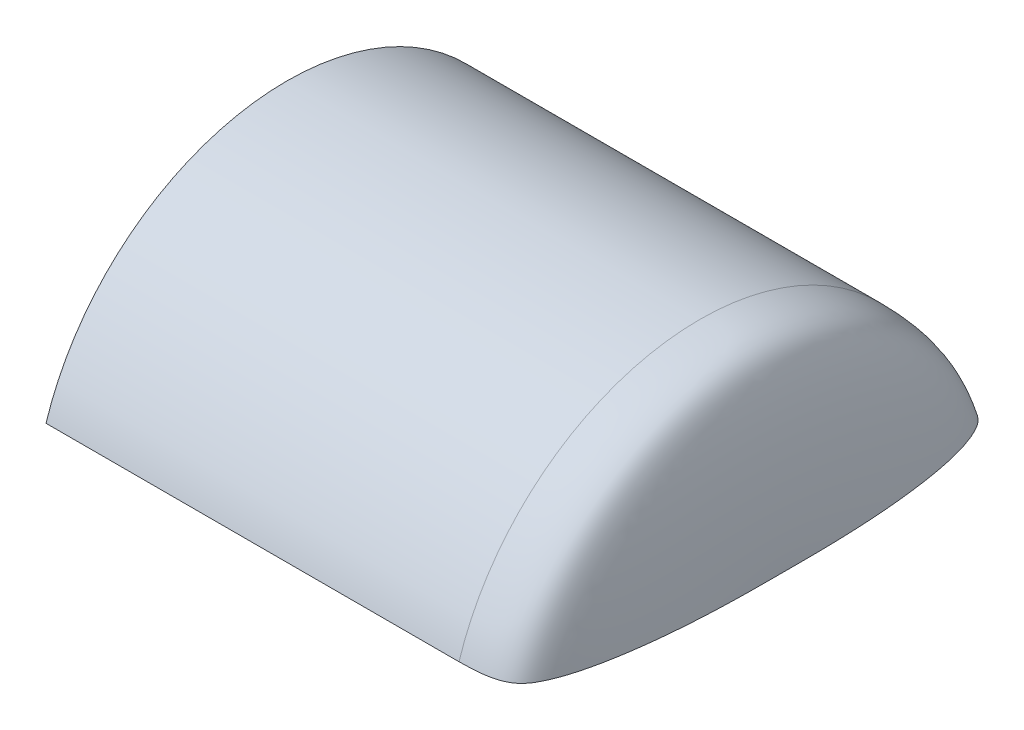
ISO-10303-21;
HEADER;
FILE_DESCRIPTION(('STEP AP214'),'2;1');
FILE_NAME('part.step','',(''),(''),'','','');
FILE_SCHEMA(('AUTOMOTIVE_DESIGN { 1 0 10303 214 1 1 1 1 }'));
ENDSEC;
DATA;
#1=APPLICATION_CONTEXT('core data for automotive mechanical design processes');
#2=APPLICATION_PROTOCOL_DEFINITION('international standard','automotive_design',2000,#1);
#3=PRODUCT_CONTEXT('',#1,'mechanical');
#4=PRODUCT('Part','Part','',(#3));
#5=PRODUCT_RELATED_PRODUCT_CATEGORY('part','',(#4));
#6=PRODUCT_DEFINITION_FORMATION('','',#4);
#7=PRODUCT_DEFINITION_CONTEXT('part definition',#1,'design');
#8=PRODUCT_DEFINITION('design','',#6,#7);
#9=PRODUCT_DEFINITION_SHAPE('','',#8);
#10=(LENGTH_UNIT() NAMED_UNIT(*) SI_UNIT(.MILLI.,.METRE.));
#11=(NAMED_UNIT(*) PLANE_ANGLE_UNIT() SI_UNIT($,.RADIAN.));
#12=(NAMED_UNIT(*) SI_UNIT($,.STERADIAN.) SOLID_ANGLE_UNIT());
#13=UNCERTAINTY_MEASURE_WITH_UNIT(LENGTH_MEASURE(1.E-05),#10,'distance_accuracy_value','');
#14=(GEOMETRIC_REPRESENTATION_CONTEXT(3) GLOBAL_UNCERTAINTY_ASSIGNED_CONTEXT((#13)) GLOBAL_UNIT_ASSIGNED_CONTEXT((#10,
#11,#12)) REPRESENTATION_CONTEXT('',''));
#15=CARTESIAN_POINT('',(0.,0.,0.));
#16=DIRECTION('',(0.,0.,1.));
#17=DIRECTION('',(1.,0.,0.));
#18=AXIS2_PLACEMENT_3D('',#15,#16,#17);
#19=CARTESIAN_POINT('',(38.,-5.00000000000001,0.));
#20=CARTESIAN_POINT('',(38.,-1.99999999999994,0.));
#21=CARTESIAN_POINT('',(37.0755397439433,14.3643578035948,0.));
#22=CARTESIAN_POINT('',(32.098350771493,18.,0.));
#23=CARTESIAN_POINT('',(26.8864656824635,18.,0.));
#24=B_SPLINE_CURVE_WITH_KNOTS('',3,(#19,#20,#21,#22,#23),.UNSPECIFIED.,.F.,.F.,(4,1,4),(0.,
0.72235855820976,1.),.UNSPECIFIED.);
#25=CARTESIAN_POINT('',(-27.,-15.,0.));
#26=DIRECTION('',(-1.,0.,0.));
#27=AXIS1_PLACEMENT('',#25,#26);
#28=SURFACE_OF_REVOLUTION('',#24,#27);
#29=CARTESIAN_POINT('',(26.9525525955181,-15.,0.));
#30=DIRECTION('',(-1.,0.,0.));
#31=DIRECTION('',(0.,0.,1.));
#32=AXIS2_PLACEMENT_3D('',#29,#30,#31);
#33=CIRCLE('',#32,32.9999455653716);
#34=CARTESIAN_POINT('',(26.952552595518,-5.,31.4483132666521));
#35=VERTEX_POINT('',#34);
#36=CARTESIAN_POINT('',(26.9525525955126,-5.,-31.4483132666521));
#37=VERTEX_POINT('',#36);
#38=EDGE_CURVE('E12',#35,#37,#33,.T.);
#39=ORIENTED_EDGE('',*,*,#38,.F.);
#40=CARTESIAN_POINT('',(26.9525525955126,-5.,-31.4483132666521));
#41=CARTESIAN_POINT('',(27.136480431403,-5.,-31.4479734762556));
#42=CARTESIAN_POINT('',(27.3204158722342,-5.,-31.4463297284682));
#43=CARTESIAN_POINT('',(27.6897594486817,-5.,-31.4398508128173));
#44=CARTESIAN_POINT('',(27.8751671076364,-5.,-31.4349892120425));
#45=CARTESIAN_POINT('',(28.2467870626247,-5.,-31.4214437368614));
#46=CARTESIAN_POINT('',(28.4329986892358,-5.,-31.4127406681363));
#47=CARTESIAN_POINT('',(28.8055457382023,-5.,-31.3907104768516));
#48=CARTESIAN_POINT('',(28.9918806031243,-5.,-31.3773737086056));
#49=CARTESIAN_POINT('',(29.3791677863206,-5.,-31.343785343024));
#50=CARTESIAN_POINT('',(29.5800802893616,-5.,-31.3230607548671));
#51=CARTESIAN_POINT('',(29.9805138152054,-5.,-31.2734729281269));
#52=CARTESIAN_POINT('',(30.1800368291149,-5.,-31.2446262158856));
#53=CARTESIAN_POINT('',(30.5768114233629,-5.00000000000001,-31.1767057905779));
#54=CARTESIAN_POINT('',(30.7740677287831,-5.00000000000001,-31.1376603098295));
#55=CARTESIAN_POINT('',(31.1653603021359,-5.,-31.0465396159089));
#56=CARTESIAN_POINT('',(31.3594006626512,-5.,-30.9944825789291));
#57=CARTESIAN_POINT('',(31.6802533801878,-5.,-30.8933442113621));
#58=CARTESIAN_POINT('',(31.8084714969214,-5.,-30.8487669247777));
#59=CARTESIAN_POINT('',(31.9982508629848,-5.00000000000001,-30.7753132407874));
#60=CARTESIAN_POINT('',(32.0610905749903,-5.,-30.7497285822683));
#61=CARTESIAN_POINT('',(32.1857888644922,-5.,-30.6962075532753));
#62=CARTESIAN_POINT('',(32.247647042081,-5.00000000000001,-30.6682702520891));
#63=CARTESIAN_POINT('',(32.4294178562076,-5.,-30.5817025031528));
#64=CARTESIAN_POINT('',(32.5476641940402,-4.99999999999999,-30.5195012683877));
#65=CARTESIAN_POINT('',(32.7780541670037,-5.00000000000002,-30.3847177252778));
#66=CARTESIAN_POINT('',(32.8902007897619,-5.00000000000005,-30.312140563413));
#67=CARTESIAN_POINT('',(33.0718435916206,-5.00000000000003,-30.1816373566058));
#68=CARTESIAN_POINT('',(33.1434022601618,-5.00000000000001,-30.1265654535497));
#69=CARTESIAN_POINT('',(33.282685120537,-5.,-30.0117458000265));
#70=CARTESIAN_POINT('',(33.3504089049991,-5.,-29.9519975544011));
#71=CARTESIAN_POINT('',(33.4817259241335,-5.00000000000001,-29.8281740990899));
#72=CARTESIAN_POINT('',(33.5453205976452,-5.00000000000001,-29.7641004127047));
#73=CARTESIAN_POINT('',(33.6687878629343,-5.,-29.6315620492068));
#74=CARTESIAN_POINT('',(33.7286286465875,-5.,-29.563067813028));
#75=CARTESIAN_POINT('',(33.8441701259658,-5.,-29.422659890067));
#76=CARTESIAN_POINT('',(33.8998699595214,-5.,-29.3507454962708));
#77=CARTESIAN_POINT('',(34.007387269249,-5.,-29.2040645210081));
#78=CARTESIAN_POINT('',(34.0592039218982,-5.,-29.129297339584));
#79=CARTESIAN_POINT('',(34.2006333337967,-5.,-28.9148234750103));
#80=CARTESIAN_POINT('',(34.2861667929666,-5.,-28.7724220061468));
#81=CARTESIAN_POINT('',(34.4078058656052,-5.,-28.5550910381638));
#82=CARTESIAN_POINT('',(34.4472655240618,-5.,-28.4819771643743));
#83=CARTESIAN_POINT('',(34.5243365350378,-5.,-28.3347798790779));
#84=CARTESIAN_POINT('',(34.5619479371321,-5.,-28.2606964936433));
#85=CARTESIAN_POINT('',(34.6724961422698,-5.,-28.0370369435317));
#86=CARTESIAN_POINT('',(34.7430268601424,-5.,-27.8862701709281));
#87=CARTESIAN_POINT('',(34.8785578926473,-5.,-27.5822517900721));
#88=CARTESIAN_POINT('',(34.9435570340662,-5.,-27.4289996628566));
#89=CARTESIAN_POINT('',(35.069285765062,-5.,-27.1192776189783));
#90=CARTESIAN_POINT('',(35.1299754184831,-5.,-26.9627915495483));
#91=CARTESIAN_POINT('',(35.2470125933516,-5.,-26.6484566135313));
#92=CARTESIAN_POINT('',(35.303365994579,-5.,-26.4906099269987));
#93=CARTESIAN_POINT('',(35.4122830334453,-5.,-26.173747843452));
#94=CARTESIAN_POINT('',(35.4648494266071,-5.,-26.014733390898));
#95=CARTESIAN_POINT('',(35.5666274755576,-5.,-25.6956936320282));
#96=CARTESIAN_POINT('',(35.6158401721178,-5.,-25.535668656314));
#97=CARTESIAN_POINT('',(35.7648168595895,-5.,-25.0347205310505));
#98=CARTESIAN_POINT('',(35.8593607855281,-5.,-24.6922394852544));
#99=CARTESIAN_POINT('',(36.0375498478023,-5.,-24.0044346792753));
#100=CARTESIAN_POINT('',(36.1211932193623,-5.,-23.6591104683879));
#101=CARTESIAN_POINT('',(36.2794881704052,-5.,-22.9658024948441));
#102=CARTESIAN_POINT('',(36.3541242900539,-5.,-22.6178152198357));
#103=CARTESIAN_POINT('',(36.4955867434678,-5.,-21.9202546060135));
#104=CARTESIAN_POINT('',(36.562412799773,-5.,-21.5706812113092));
#105=CARTESIAN_POINT('',(36.6893874346584,-5.,-20.8697094168381));
#106=CARTESIAN_POINT('',(36.7495243569623,-5.,-20.5183089146505));
#107=CARTESIAN_POINT('',(36.8637855250613,-5.,-19.8145336405629));
#108=CARTESIAN_POINT('',(36.9179096976133,-5.,-19.4621588568484));
#109=CARTESIAN_POINT('',(37.0722757587965,-5.,-18.4036863356056));
#110=CARTESIAN_POINT('',(37.1644811137576,-5.,-17.6964103695103));
#111=CARTESIAN_POINT('',(37.3309162503096,-5.,-16.2819554548718));
#112=CARTESIAN_POINT('',(37.4051994980892,-5.,-15.5747826689874));
#113=CARTESIAN_POINT('',(37.5384540166116,-5.,-14.1599661555869));
#114=CARTESIAN_POINT('',(37.5974457714543,-5.,-13.4523243445311));
#115=CARTESIAN_POINT('',(37.7018582304228,-5.,-12.0364992983688));
#116=CARTESIAN_POINT('',(37.7472874653447,-5.,-11.3283166856949));
#117=CARTESIAN_POINT('',(37.8257788745401,-5.00000000000001,-9.91129414806904));
#118=CARTESIAN_POINT('',(37.8588414695558,-5.00000000000001,-9.20245424630231));
#119=CARTESIAN_POINT('',(37.9044025330919,-5.00000000000001,-8.02179969819269));
#120=CARTESIAN_POINT('',(37.9200797145402,-5.,-7.55010408379088));
#121=CARTESIAN_POINT('',(37.9467153301325,-5.,-6.60647891340279));
#122=CARTESIAN_POINT('',(37.9576727569366,-5.,-6.13454932897664));
#123=CARTESIAN_POINT('',(37.9753134996958,-5.,-5.19058884678525));
#124=CARTESIAN_POINT('',(37.9819966034266,-5.,-4.71855794515333));
#125=CARTESIAN_POINT('',(37.9917938037771,-5.,-3.77467803439158));
#126=CARTESIAN_POINT('',(37.9949095370877,-5.,-3.30282904121573));
#127=CARTESIAN_POINT('',(37.9987452176436,-5.,-2.35914940507137));
#128=CARTESIAN_POINT('',(37.9994652952668,-5.00000000000001,-1.88731876250176));
#129=CARTESIAN_POINT('',(37.9999181030361,-5.,-1.17957358898001));
#130=CARTESIAN_POINT('',(37.9999644877564,-5.,-0.943658875944369));
#131=CARTESIAN_POINT('',(38.00000499613,-5.00000000000001,-0.471829440144158));
#132=CARTESIAN_POINT('',(37.9999991197921,-5.00000000000001,-0.235914717379595));
#133=CARTESIAN_POINT('',(38.000001087769,-5.00000000000001,0.291545577142286));
#134=CARTESIAN_POINT('',(38.0000124942992,-5.00000000000001,0.583091146060518));
#135=CARTESIAN_POINT('',(37.9999169383666,-5.,1.16618241976754));
#136=CARTESIAN_POINT('',(37.9998099758475,-5.,1.45772812455634));
#137=CARTESIAN_POINT('',(37.999137352639,-5.,2.04081963151991));
#138=CARTESIAN_POINT('',(37.998571691409,-5.,2.3323654336944));
#139=CARTESIAN_POINT('',(37.9966159928841,-5.,2.91545407572311));
#140=CARTESIAN_POINT('',(37.9952259561142,-5.,3.2069969155791));
#141=CARTESIAN_POINT('',(37.9893267593963,-5.,4.08161598706542));
#142=CARTESIAN_POINT('',(37.9830885134119,-5.,4.6646830902612));
#143=CARTESIAN_POINT('',(37.9643230882571,-5.,5.83077460896654));
#144=CARTESIAN_POINT('',(37.9517953229083,-5.,6.41379901543043));
#145=CARTESIAN_POINT('',(37.9195575011111,-5.,7.57965909529887));
#146=CARTESIAN_POINT('',(37.8998473592325,-5.,8.16249476637599));
#147=CARTESIAN_POINT('',(37.8526470128677,-5.,9.3278422349456));
#148=CARTESIAN_POINT('',(37.8251569552231,-5.,9.91035403834302));
#149=CARTESIAN_POINT('',(37.7610228182227,-5.,11.090420424919));
#150=CARTESIAN_POINT('',(37.7241546601702,-5.,11.6879629164199));
#151=CARTESIAN_POINT('',(37.6409862926568,-5.,12.8824118854146));
#152=CARTESIAN_POINT('',(37.5946858196393,-5.,13.4793183446678));
#153=CARTESIAN_POINT('',(37.4917631434494,-5.,14.6723242898484));
#154=CARTESIAN_POINT('',(37.4351396102031,-5.,15.2684236618046));
#155=CARTESIAN_POINT('',(37.3103347430002,-5.,16.4597064174528));
#156=CARTESIAN_POINT('',(37.2421479435001,-5.,17.0548892330542));
#157=CARTESIAN_POINT('',(37.0925544762656,-5.,18.2435449594863));
#158=CARTESIAN_POINT('',(37.0111491424058,-5.,18.8370180367024));
#159=CARTESIAN_POINT('',(36.8327518916468,-5.00000000000001,20.0214945650221));
#160=CARTESIAN_POINT('',(36.7357638308317,-5.00000000000001,20.6124985900876));
#161=CARTESIAN_POINT('',(36.541340828008,-5.00000000000001,21.6879559558543));
#162=CARTESIAN_POINT('',(36.4469551438508,-5.00000000000001,22.1729538514985));
#163=CARTESIAN_POINT('',(36.2934231225142,-5.,22.8980128447925));
#164=CARTESIAN_POINT('',(36.2402417980955,-5.,23.1393404922709));
#165=CARTESIAN_POINT('',(36.129405018738,-5.,23.6209632596299));
#166=CARTESIAN_POINT('',(36.071749702797,-5.,23.8612584113434));
#167=CARTESIAN_POINT('',(35.9514144654106,-5.,24.3404366144067));
#168=CARTESIAN_POINT('',(35.8887376172365,-5.,24.5793204348249));
#169=CARTESIAN_POINT('',(35.7575972540329,-5.,25.0554866842399));
#170=CARTESIAN_POINT('',(35.6891341030541,-5.,25.2927692129707));
#171=CARTESIAN_POINT('',(35.5455299674777,-5.,25.765151330185));
#172=CARTESIAN_POINT('',(35.4703931818482,-5.,26.0002521899214));
#173=CARTESIAN_POINT('',(35.3122144842981,-5.00000000000001,26.4677639208346));
#174=CARTESIAN_POINT('',(35.2291739376099,-5.00000000000001,26.700175248829));
#175=CARTESIAN_POINT('',(35.0971627426632,-5.00000000000001,27.0468941940641));
#176=CARTESIAN_POINT('',(35.0517427522365,-5.,27.162557726892));
#177=CARTESIAN_POINT('',(34.9582200974916,-5.,27.3928123140017));
#178=CARTESIAN_POINT('',(34.9101171699769,-5.,27.5074032617703));
#179=CARTESIAN_POINT('',(34.8109161755962,-5.,27.7353326335093));
#180=CARTESIAN_POINT('',(34.7598170682099,-5.,27.8486706059076));
#181=CARTESIAN_POINT('',(34.6542934254986,-5.,28.0737766939399));
#182=CARTESIAN_POINT('',(34.5998692505117,-5.,28.1855449780726));
#183=CARTESIAN_POINT('',(34.4872641827884,-5.,28.4071573038611));
#184=CARTESIAN_POINT('',(34.4290840625581,-5.00000000000001,28.5170017353354));
#185=CARTESIAN_POINT('',(34.3077650112187,-5.,28.7339032664629));
#186=CARTESIAN_POINT('',(34.2446275221263,-5.,28.8409611646964));
#187=CARTESIAN_POINT('',(34.1107449177515,-5.,29.0534923639459));
#188=CARTESIAN_POINT('',(34.0398650672657,-5.,29.1588816566719));
#189=CARTESIAN_POINT('',(33.8905616599877,-5.00000000000001,29.3641927240216));
#190=CARTESIAN_POINT('',(33.8121396295354,-5.00000000000001,29.4641155985108));
#191=CARTESIAN_POINT('',(33.6474727107738,-5.,29.6564979476019));
#192=CARTESIAN_POINT('',(33.5612677987227,-5.,29.7489914134705));
#193=CARTESIAN_POINT('',(33.3807062594319,-5.00000000000001,29.9256697026315));
#194=CARTESIAN_POINT('',(33.28634983842,-5.00000000000002,30.0098547360063));
#195=CARTESIAN_POINT('',(33.0898108058939,-5.00000000000002,30.1692808399992));
#196=CARTESIAN_POINT('',(32.987601668018,-5.00000000000001,30.2444891885725));
#197=CARTESIAN_POINT('',(32.7768111730877,-5.,30.3853526623773));
#198=CARTESIAN_POINT('',(32.6682290969681,-5.,30.4510067066678));
#199=CARTESIAN_POINT('',(32.4455027275867,-5.00000000000001,30.5734012330753));
#200=CARTESIAN_POINT('',(32.3313341067638,-5.00000000000001,30.6300971413046));
#201=CARTESIAN_POINT('',(32.0991832274175,-5.,30.7349720238978));
#202=CARTESIAN_POINT('',(31.981200781299,-5.,30.7831505785522));
#203=CARTESIAN_POINT('',(31.6831173651786,-4.99999999999999,30.8940471980906));
#204=CARTESIAN_POINT('',(31.5012831933142,-5.,30.9520926899803));
#205=CARTESIAN_POINT('',(31.133662364947,-5.00000000000001,31.0546356419621));
#206=CARTESIAN_POINT('',(30.9478702313674,-5.00000000000001,31.0991128205511));
#207=CARTESIAN_POINT('',(30.5739187600747,-5.,31.1772653935749));
#208=CARTESIAN_POINT('',(30.3857576669704,-5.,31.2109322202736));
#209=CARTESIAN_POINT('',(30.0071667940879,-5.,31.2697848958489));
#210=CARTESIAN_POINT('',(29.816730343539,-5.,31.2949267528316));
#211=CARTESIAN_POINT('',(29.4352701292762,-5.00000000000001,31.3382018578953));
#212=CARTESIAN_POINT('',(29.2442471210194,-5.00000000000001,31.3563419284822));
#213=CARTESIAN_POINT('',(28.8617925837505,-5.,31.3869623558985));
#214=CARTESIAN_POINT('',(28.6703611357319,-4.99999999999999,31.3994437459213));
#215=CARTESIAN_POINT('',(28.39369304536,-5.,31.4141135200853));
#216=CARTESIAN_POINT('',(28.3085493437764,-5.,31.4181677493044));
#217=CARTESIAN_POINT('',(28.1382222899206,-5.00000000000001,31.4254290299801));
#218=CARTESIAN_POINT('',(28.0530389363673,-5.,31.4286360518405));
#219=CARTESIAN_POINT('',(27.8826444993596,-5.,31.434270707577));
#220=CARTESIAN_POINT('',(27.7974334151342,-5.,31.4366983175242));
#221=CARTESIAN_POINT('',(27.4590456499415,-5.00000000000001,31.4449001017862));
#222=CARTESIAN_POINT('',(27.205796582021,-5.00000000000001,31.4478410955669));
#223=CARTESIAN_POINT('',(26.952552595518,-4.99999999999999,31.4483132666521));
#224=B_SPLINE_CURVE_WITH_KNOTS('',3,(#40,#41,#42,#43,#44,#45,#46,#47,#48,#49,#50,#51,#52,#53,
#54,#55,#56,#57,#58,#59,#60,#61,#62,#63,#64,#65,#66,#67,#68,#69,#70,#71,#72,#73,#74,#75,#76,#77,
#78,#79,#80,#81,#82,#83,#84,#85,#86,#87,#88,#89,#90,#91,#92,#93,#94,#95,#96,#97,#98,#99,#100,
#101,#102,#103,#104,#105,#106,#107,#108,#109,#110,#111,#112,#113,#114,#115,#116,#117,#118,#119,
#120,#121,#122,#123,#124,#125,#126,#127,#128,#129,#130,#131,#132,#133,#134,#135,#136,#137,#138,
#139,#140,#141,#142,#143,#144,#145,#146,#147,#148,#149,#150,#151,#152,#153,#154,#155,#156,#157,
#158,#159,#160,#161,#162,#163,#164,#165,#166,#167,#168,#169,#170,#171,#172,#173,#174,#175,#176,
#177,#178,#179,#180,#181,#182,#183,#184,#185,#186,#187,#188,#189,#190,#191,#192,#193,#194,#195,
#196,#197,#198,#199,#200,#201,#202,#203,#204,#205,#206,#207,#208,#209,#210,#211,#212,#213,#214,
#215,#216,#217,#218,#219,#220,#221,#222,#223),.UNSPECIFIED.,.F.,.F.,(4,2,2,2,2,2,2,2,2,2,2,2,2,
2,2,2,2,2,2,2,2,2,2,2,2,2,2,2,2,2,2,2,2,2,2,2,2,2,2,2,2,2,2,2,2,2,2,2,2,2,2,2,2,2,2,2,2,2,2,2,2,
2,2,2,2,2,2,2,2,2,2,2,2,2,2,2,2,2,2,2,2,2,2,2,2,2,2,2,2,2,2,4),(0.,0.551794777005203,
1.10817945421628,1.66737620683822,2.2277440489956,2.83354792433946,3.43812795033389,
4.04105178995775,4.64313805075006,5.05008116626161,5.2535828598069,5.45716544084927,
5.85748686640648,6.2576104162442,6.52831363154212,6.79904554934816,7.0696826152956,
7.34236769205677,7.61510938532096,7.88790875734145,8.3857297396708,8.63496456711817,
8.88419270580787,9.38339699876342,9.88270690736666,10.3861630564496,10.8889240482707,
11.3913154442593,11.8935502135253,12.9591711006079,14.0249642955871,15.0925615322809,
16.1601966848697,17.2296640454398,18.2991444320664,20.4386227184849,22.5716372125597,
24.7017794328445,26.8305789615269,28.9593060568529,30.3751518415302,31.7912996613929,
33.2075177889238,34.6230859023029,36.0385769754674,36.7463212335515,37.4540653717851,
38.3287020860279,39.2033392165683,40.0779773779903,40.9526149824643,42.7018892324911,
44.4513265438334,46.2007846644166,47.9502097671331,49.7461769889023,51.5421944002359,
53.3384433830386,55.135543767255,56.9324629196812,58.7289380914565,60.2109886222901,
60.9523080236068,61.6936044028476,62.4344505106799,63.1752500421132,63.9155867295061,
64.655795768337,65.0285545049506,65.401349873801,65.7742754836225,66.147160750861,
66.519969567552,66.8926703392359,67.2734113627689,67.6540754957667,68.0328849515651,
68.4116848265407,68.7918258692115,69.1720098863521,69.5540297839826,69.9360685011526,
70.507959529679,71.080701261578,71.6538958054658,72.2300047571945,72.8055509255141,
73.3809919650359,73.6367096400304,73.892436247091,74.1481707045739,74.9078912080481),.UNSPECIFIED.);
#225=EDGE_CURVE('E44',#37,#35,#224,.T.);
#226=ORIENTED_EDGE('',*,*,#225,.F.);
#227=EDGE_LOOP('',(#39,#226));
#228=FACE_BOUND('',#227,.T.);
#229=ADVANCED_FACE('F36',(#228),#28,.T.);
#230=CARTESIAN_POINT('',(-27.,-15.,0.));
#231=DIRECTION('',(1.,0.,0.));
#232=DIRECTION('',(0.,0.,-1.));
#233=AXIS2_PLACEMENT_3D('',#230,#231,#232);
#234=CYLINDRICAL_SURFACE('',#233,32.9999455653716);
#235=ORIENTED_EDGE('',*,*,#38,.T.);
#236=DIRECTION('',(1.,0.,0.));
#237=VECTOR('',#236,1.);
#238=CARTESIAN_POINT('',(-27.,-5.,-31.4483132666521));
#239=LINE('',#238,#237);
#240=CARTESIAN_POINT('',(-27.,-5.,-31.4483132666521));
#241=VERTEX_POINT('',#240);
#242=EDGE_CURVE('E58',#241,#37,#239,.T.);
#243=ORIENTED_EDGE('',*,*,#242,.F.);
#244=CARTESIAN_POINT('',(-27.,-15.,0.));
#245=DIRECTION('',(1.,0.,0.));
#246=DIRECTION('',(0.,0.,-1.));
#247=AXIS2_PLACEMENT_3D('',#244,#245,#246);
#248=CIRCLE('',#247,32.9999455653716);
#249=CARTESIAN_POINT('',(-27.,-5.,31.4483132666521));
#250=VERTEX_POINT('',#249);
#251=EDGE_CURVE('E85',#241,#250,#248,.T.);
#252=ORIENTED_EDGE('',*,*,#251,.T.);
#253=DIRECTION('',(1.,0.,0.));
#254=VECTOR('',#253,1.);
#255=CARTESIAN_POINT('',(-27.,-5.,31.4483132666521));
#256=LINE('',#255,#254);
#257=EDGE_CURVE('E74',#250,#35,#256,.T.);
#258=ORIENTED_EDGE('',*,*,#257,.T.);
#259=EDGE_LOOP('',(#235,#243,#252,#258));
#260=FACE_BOUND('',#259,.T.);
#261=ADVANCED_FACE('F86',(#260),#234,.T.);
#262=CARTESIAN_POINT('',(-27.,-5.,31.4483132666521));
#263=DIRECTION('',(0.,-1.,0.));
#264=DIRECTION('',(0.,0.,-1.));
#265=AXIS2_PLACEMENT_3D('',#262,#263,#264);
#266=PLANE('',#265);
#267=DIRECTION('',(-1.,0.,0.));
#268=VECTOR('',#267,1.);
#269=CARTESIAN_POINT('',(-27.,-5.,-28.2842712474619));
#270=LINE('',#269,#268);
#271=CARTESIAN_POINT('',(27.,-5.,-28.2842712474619));
#272=VERTEX_POINT('',#271);
#273=CARTESIAN_POINT('',(-27.,-5.,-28.2842712474619));
#274=VERTEX_POINT('',#273);
#275=EDGE_CURVE('E105',#272,#274,#270,.T.);
#276=ORIENTED_EDGE('',*,*,#275,.T.);
#277=DIRECTION('',(0.,0.,-1.));
#278=VECTOR('',#277,1.);
#279=CARTESIAN_POINT('',(-27.,-5.,31.4483132666521));
#280=LINE('',#279,#278);
#281=EDGE_CURVE('E89',#274,#241,#280,.T.);
#282=ORIENTED_EDGE('',*,*,#281,.T.);
#283=ORIENTED_EDGE('',*,*,#242,.T.);
#284=ORIENTED_EDGE('',*,*,#225,.T.);
#285=ORIENTED_EDGE('',*,*,#257,.F.);
#286=CARTESIAN_POINT('',(-27.,-5.,28.2842712474619));
#287=VERTEX_POINT('',#286);
#288=EDGE_CURVE('E78',#250,#287,#280,.T.);
#289=ORIENTED_EDGE('',*,*,#288,.T.);
#290=DIRECTION('',(-1.,0.,0.));
#291=VECTOR('',#290,1.);
#292=CARTESIAN_POINT('',(-27.,-5.,28.2842712474619));
#293=LINE('',#292,#291);
#294=CARTESIAN_POINT('',(27.,-5.,28.2842712474619));
#295=VERTEX_POINT('',#294);
#296=EDGE_CURVE('E96',#287,#295,#293,.F.);
#297=ORIENTED_EDGE('',*,*,#296,.T.);
#298=CARTESIAN_POINT('',(27.,-5.00000000000001,28.2842712474619));
#299=CARTESIAN_POINT('',(27.0841993853191,-5.00000000000001,28.2842791214411));
#300=CARTESIAN_POINT('',(27.1684079247845,-5.,28.2820731266872));
#301=CARTESIAN_POINT('',(27.3366148896231,-5.,28.2730953554925));
#302=CARTESIAN_POINT('',(27.4206132135199,-5.,28.2663216882786));
#303=CARTESIAN_POINT('',(27.5881066224986,-5.,28.2480696972331));
#304=CARTESIAN_POINT('',(27.6716016742597,-5.,28.2365910652917));
#305=CARTESIAN_POINT('',(27.8372800403594,-5.,28.2089453848082));
#306=CARTESIAN_POINT('',(27.9194682799311,-5.00000000000001,28.1928078809085));
#307=CARTESIAN_POINT('',(28.0827623835013,-5.,28.1558075090389));
#308=CARTESIAN_POINT('',(28.1638684225351,-5.,28.1349454152803));
#309=CARTESIAN_POINT('',(28.3247200265697,-5.00000000000001,28.088552021881));
#310=CARTESIAN_POINT('',(28.4044657209715,-5.00000000000001,28.0630211690881));
#311=CARTESIAN_POINT('',(28.6020506886807,-5.00000000000002,27.9934056379464));
#312=CARTESIAN_POINT('',(28.7188890298967,-5.00000000000001,27.9464454892561));
#313=CARTESIAN_POINT('',(28.9482162051227,-5.,27.8428043656157));
#314=CARTESIAN_POINT('',(29.0607028065927,-5.,27.7861184801093));
#315=CARTESIAN_POINT('',(29.2807704684693,-5.00000000000001,27.6638401383773));
#316=CARTESIAN_POINT('',(29.3883496426626,-5.00000000000001,27.5982442954258));
#317=CARTESIAN_POINT('',(29.5982424815103,-5.,27.4590908135846));
#318=CARTESIAN_POINT('',(29.7005546167045,-5.,27.3855308810843));
#319=CARTESIAN_POINT('',(29.9436471084542,-5.,27.1974654597188));
#320=CARTESIAN_POINT('',(30.0815231898024,-5.,27.0791955884323));
#321=CARTESIAN_POINT('',(30.3462195492164,-5.00000000000001,26.830862258787));
#322=CARTESIAN_POINT('',(30.4730338822066,-5.,26.7007925343364));
#323=CARTESIAN_POINT('',(30.7165045080471,-5.,26.4308946935729));
#324=CARTESIAN_POINT('',(30.8331326753889,-5.00000000000001,26.291041366399));
#325=CARTESIAN_POINT('',(31.0566612782739,-5.,26.003849089947));
#326=CARTESIAN_POINT('',(31.163563151756,-5.,25.8565112522173));
#327=CARTESIAN_POINT('',(31.3620082135444,-5.,25.565460384033));
#328=CARTESIAN_POINT('',(31.4540962279639,-5.,25.4221165267237));
#329=CARTESIAN_POINT('',(31.6312691488059,-5.00000000000001,25.1311498776089));
#330=CARTESIAN_POINT('',(31.7163526573997,-5.,24.9835262396342));
#331=CARTESIAN_POINT('',(31.9622018171067,-5.,24.5352606975197));
#332=CARTESIAN_POINT('',(32.1134585002366,-5.,24.2293861646983));
#333=CARTESIAN_POINT('',(32.3953912562822,-5.,23.6076419752086));
#334=CARTESIAN_POINT('',(32.5260193547567,-5.,23.2917510128839));
#335=CARTESIAN_POINT('',(32.7698258562446,-5.00000000000001,22.6535130425205));
#336=CARTESIAN_POINT('',(32.8830118415863,-5.00000000000001,22.3311689090151));
#337=CARTESIAN_POINT('',(33.0783875296958,-5.00000000000001,21.7319649985658));
#338=CARTESIAN_POINT('',(33.1626640339125,-5.00000000000001,21.45577702746));
#339=CARTESIAN_POINT('',(33.3220981630813,-5.,20.900764662383));
#340=CARTESIAN_POINT('',(33.3972549741755,-5.,20.6219400355019));
#341=CARTESIAN_POINT('',(33.5396174455398,-5.,20.0619262381307));
#342=CARTESIAN_POINT('',(33.6068135411116,-5.,19.7807346494308));
#343=CARTESIAN_POINT('',(33.7340497830237,-5.,19.2167308842625));
#344=CARTESIAN_POINT('',(33.7940895211544,-5.,18.9339186163115));
#345=CARTESIAN_POINT('',(33.9647924080441,-5.,18.0827659838929));
#346=CARTESIAN_POINT('',(34.0658461814841,-5.,17.5124886103));
#347=CARTESIAN_POINT('',(34.2470730065602,-5.,16.3685826707987));
#348=CARTESIAN_POINT('',(34.3272416104293,-5.,15.7949534176144));
#349=CARTESIAN_POINT('',(34.4703543559515,-5.,14.6435038877223));
#350=CARTESIAN_POINT('',(34.5332363037399,-5.,14.0656759618022));
#351=CARTESIAN_POINT('',(34.6440146210006,-5.,12.9092932084471));
#352=CARTESIAN_POINT('',(34.6919284950035,-5.,12.3307400305384));
#353=CARTESIAN_POINT('',(34.7750190768672,-5.,11.173019584447));
#354=CARTESIAN_POINT('',(34.81020202651,-5.00000000000001,10.5938527572036));
#355=CARTESIAN_POINT('',(34.8697512112067,-5.,9.43500181164214));
#356=CARTESIAN_POINT('',(34.8941179619363,-5.,8.85531771930607));
#357=CARTESIAN_POINT('',(34.9297371250307,-5.,7.81545508358441));
#358=CARTESIAN_POINT('',(34.94265894595,-5.,7.3553314840419));
#359=CARTESIAN_POINT('',(34.9637664795631,-5.,6.43490720319075));
#360=CARTESIAN_POINT('',(34.9719514640601,-5.,5.97460650553483));
#361=CARTESIAN_POINT('',(34.9845920367517,-5.,5.05393315417472));
#362=CARTESIAN_POINT('',(34.989047431387,-5.,4.593560497976));
#363=CARTESIAN_POINT('',(34.9953253037167,-5.,3.67392550396946));
#364=CARTESIAN_POINT('',(34.997154195109,-5.,3.21466320479844));
#365=CARTESIAN_POINT('',(34.9993489559032,-5.,2.29616150304284));
#366=CARTESIAN_POINT('',(34.9997149054893,-5.,1.83692210058302));
#367=CARTESIAN_POINT('',(35.0000430538898,-5.,0.918455136549639));
#368=CARTESIAN_POINT('',(35.0000052630282,-5.,0.459227574973583));
#369=CARTESIAN_POINT('',(34.9999966221867,-5.,-0.294732412243799));
#370=CARTESIAN_POINT('',(35.0000066428377,-5.,-0.589464830006143));
#371=CARTESIAN_POINT('',(34.9999512822914,-5.,-1.1789296518923));
#372=CARTESIAN_POINT('',(34.999885901101,-5.,-1.47366205601611));
#373=CARTESIAN_POINT('',(34.9992667309414,-5.,-2.3578619391085));
#374=CARTESIAN_POINT('',(34.9982899118478,-5.,-2.94732917458082));
#375=CARTESIAN_POINT('',(34.9928572586242,-5.,-4.12633026901833));
#376=CARTESIAN_POINT('',(34.9884009875822,-5.,-4.71586412705325));
#377=CARTESIAN_POINT('',(34.9736273247776,-5.,-5.89484587964054));
#378=CARTESIAN_POINT('',(34.9633099918764,-5.,-6.48429377499676));
#379=CARTESIAN_POINT('',(34.9203362053215,-5.,-8.25401054353696));
#380=CARTESIAN_POINT('',(34.875653492911,-5.,-9.43408044515079));
#381=CARTESIAN_POINT('',(34.7730730653569,-5.,-11.2019911278957));
#382=CARTESIAN_POINT('',(34.7329595055633,-5.,-11.7908683124648));
#383=CARTESIAN_POINT('',(34.6388284377535,-5.,-12.9674981022987));
#384=CARTESIAN_POINT('',(34.5848118899294,-5.00000000000001,-13.555250782403));
#385=CARTESIAN_POINT('',(34.4788650468763,-5.00000000000001,-14.5549251904643));
#386=CARTESIAN_POINT('',(34.4310691770539,-5.,-14.9672854277372));
#387=CARTESIAN_POINT('',(34.326333931476,-5.,-15.7908793511001));
#388=CARTESIAN_POINT('',(34.269393998068,-5.,-16.2021129669262));
#389=CARTESIAN_POINT('',(34.1451071659507,-5.,-17.0231196863474));
#390=CARTESIAN_POINT('',(34.0777577050698,-5.,-17.4328924048884));
#391=CARTESIAN_POINT('',(33.9313285688485,-5.,-18.2490993990475));
#392=CARTESIAN_POINT('',(33.8522843382945,-5.,-18.6555399761686));
#393=CARTESIAN_POINT('',(33.6803926112946,-5.,-19.4654347881217));
#394=CARTESIAN_POINT('',(33.5875476783418,-5.00000000000001,-19.8688895629893));
#395=CARTESIAN_POINT('',(33.385587101895,-5.,-20.6715929472982));
#396=CARTESIAN_POINT('',(33.2764781482108,-5.,-21.070843214208));
#397=CARTESIAN_POINT('',(33.0800146983335,-5.,-21.7256501151613));
#398=CARTESIAN_POINT('',(32.9982892834419,-5.,-21.9828957381403));
#399=CARTESIAN_POINT('',(32.8253180323325,-5.,-22.4941926028843));
#400=CARTESIAN_POINT('',(32.7340720780466,-5.,-22.7482438049901));
#401=CARTESIAN_POINT('',(32.5402409744788,-5.,-23.2532501556887));
#402=CARTESIAN_POINT('',(32.4376093072485,-5.,-23.5041875699391));
#403=CARTESIAN_POINT('',(32.2195775932194,-5.,-24.000482148392));
#404=CARTESIAN_POINT('',(32.1041782254282,-5.,-24.2458396085099));
#405=CARTESIAN_POINT('',(31.85639058448,-5.,-24.7331549364926));
#406=CARTESIAN_POINT('',(31.7237469912157,-5.,-24.9749842295386));
#407=CARTESIAN_POINT('',(31.4402793654798,-5.00000000000001,-25.448057436631));
#408=CARTESIAN_POINT('',(31.289445765395,-5.,-25.6792956909819));
#409=CARTESIAN_POINT('',(30.9677477956415,-5.,-26.1251377929574));
#410=CARTESIAN_POINT('',(30.7970288944446,-5.,-26.3398454543122));
#411=CARTESIAN_POINT('',(30.4319080512163,-5.,-26.7479791371892));
#412=CARTESIAN_POINT('',(30.2375473085047,-5.,-26.9414410936043));
#413=CARTESIAN_POINT('',(29.9312073677524,-5.,-27.2057852387659));
#414=CARTESIAN_POINT('',(29.8289874557055,-5.,-27.288068854132));
#415=CARTESIAN_POINT('',(29.6186809210098,-5.,-27.4447991771568));
#416=CARTESIAN_POINT('',(29.5105949481367,-5.,-27.5192467501291));
#417=CARTESIAN_POINT('',(29.2888947630335,-5.,-27.6591281605936));
#418=CARTESIAN_POINT('',(29.1752869046481,-5.00000000000001,-27.7245720409114));
#419=CARTESIAN_POINT('',(28.942898324996,-5.,-27.8455042004397));
#420=CARTESIAN_POINT('',(28.8241190152027,-5.,-27.9009951752452));
#421=CARTESIAN_POINT('',(28.6139946384216,-5.,-27.9879776108428));
#422=CARTESIAN_POINT('',(28.5236650441928,-5.,-28.0219404856346));
#423=CARTESIAN_POINT('',(28.3409168885419,-5.00000000000001,-28.0837791251972));
#424=CARTESIAN_POINT('',(28.248497878142,-5.,-28.1116535676874));
#425=CARTESIAN_POINT('',(28.0619817397361,-5.,-28.1611611688278));
#426=CARTESIAN_POINT('',(27.96788421822,-5.,-28.1827928429493));
#427=CARTESIAN_POINT('',(27.7773575901064,-5.,-28.219988212384));
#428=CARTESIAN_POINT('',(27.6809140886934,-5.,-28.2354781359642));
#429=CARTESIAN_POINT('',(27.4872281008867,-5.,-28.260097322056));
#430=CARTESIAN_POINT('',(27.3899856380018,-5.,-28.2692267710461));
#431=CARTESIAN_POINT('',(27.1951567092716,-5.,-28.2813198054492));
#432=CARTESIAN_POINT('',(27.0975704048985,-5.,-28.2842859765624));
#433=CARTESIAN_POINT('',(27.,-5.,-28.2842712474619));
#434=B_SPLINE_CURVE_WITH_KNOTS('',3,(#298,#299,#300,#301,#302,#303,#304,#305,#306,#307,#308,
#309,#310,#311,#312,#313,#314,#315,#316,#317,#318,#319,#320,#321,#322,#323,#324,#325,#326,#327,
#328,#329,#330,#331,#332,#333,#334,#335,#336,#337,#338,#339,#340,#341,#342,#343,#344,#345,#346,
#347,#348,#349,#350,#351,#352,#353,#354,#355,#356,#357,#358,#359,#360,#361,#362,#363,#364,#365,
#366,#367,#368,#369,#370,#371,#372,#373,#374,#375,#376,#377,#378,#379,#380,#381,#382,#383,#384,
#385,#386,#387,#388,#389,#390,#391,#392,#393,#394,#395,#396,#397,#398,#399,#400,#401,#402,#403,
#404,#405,#406,#407,#408,#409,#410,#411,#412,#413,#414,#415,#416,#417,#418,#419,#420,#421,#422,
#423,#424,#425,#426,#427,#428,#429,#430,#431,#432,#433),.UNSPECIFIED.,.F.,.F.,(4,2,2,2,2,2,2,2,
2,2,2,2,2,2,2,2,2,2,2,2,2,2,2,2,2,2,2,2,2,2,2,2,2,2,2,2,2,2,2,2,2,2,2,2,2,2,2,2,2,2,2,2,2,2,2,2,
2,2,2,2,2,2,2,2,2,2,2,4),(0.,0.252582501556884,0.505269623051057,0.757973294683625,
1.00910836112793,1.2602023042041,1.51127222760566,1.88854459512066,2.26600801228457,
2.64361530905778,3.02133164523277,3.56540902950096,4.10977704629958,4.65560352383439,
5.20134917460664,5.71225087419009,6.22325428410574,7.24584245275135,8.2707748304716,
9.29526039129403,10.1613739351756,11.0275647158375,11.8947858799067,12.7620564879747,
14.4990024525118,16.2363180203366,17.9798046415733,19.7212446292107,21.4618296542932,
23.2023316859109,24.5832197584526,25.9643200594138,27.3454920326815,28.7232855327329,
30.1010035144228,31.4786862667423,32.3628835210582,33.2470806966756,35.0154837905545,
36.7841089770923,38.5527164019729,42.0946465298117,43.8652460444787,45.6357233077733,
46.8810009005168,48.1263544656242,49.3720150481238,50.6139747898483,51.8557041240355,
53.0969241052664,53.9065180629983,54.7161220620392,55.5291649237605,56.3421645672801,
57.1689764400516,57.9962251133274,58.8177629659529,59.6378891466017,60.0312585181639,
60.424584405311,60.8174679521876,61.2102449312471,61.4995555563852,61.7889289514221,
62.0783711027866,62.3711915912628,62.6640034943727,62.9566925283239),.UNSPECIFIED.);
#435=EDGE_CURVE('E50',#295,#272,#434,.T.);
#436=ORIENTED_EDGE('',*,*,#435,.T.);
#437=EDGE_LOOP('',(#276,#282,#283,#284,#285,#289,#297,#436));
#438=FACE_BOUND('',#437,.T.);
#439=ADVANCED_FACE('F76',(#438),#266,.T.);
#440=CARTESIAN_POINT('',(-27.,18.,0.));
#441=DIRECTION('',(1.,0.,0.));
#442=DIRECTION('',(0.,0.,-1.));
#443=AXIS2_PLACEMENT_3D('',#440,#441,#442);
#444=PLANE('',#443);
#445=ORIENTED_EDGE('',*,*,#288,.F.);
#446=ORIENTED_EDGE('',*,*,#251,.F.);
#447=ORIENTED_EDGE('',*,*,#281,.F.);
#448=CARTESIAN_POINT('',(-27.,-15.,0.));
#449=DIRECTION('',(-1.,0.,0.));
#450=DIRECTION('',(0.,0.,1.));
#451=AXIS2_PLACEMENT_3D('',#448,#449,#450);
#452=CIRCLE('',#451,30.);
#453=EDGE_CURVE('E93',#287,#274,#452,.T.);
#454=ORIENTED_EDGE('',*,*,#453,.F.);
#455=EDGE_LOOP('',(#445,#446,#447,#454));
#456=FACE_BOUND('',#455,.T.);
#457=ADVANCED_FACE('F38',(#456),#444,.F.);
#458=CARTESIAN_POINT('',(-27.,-15.,0.));
#459=DIRECTION('',(-1.,0.,0.));
#460=DIRECTION('',(0.,0.,1.));
#461=AXIS2_PLACEMENT_3D('',#458,#459,#460);
#462=CYLINDRICAL_SURFACE('',#461,30.);
#463=ORIENTED_EDGE('',*,*,#296,.F.);
#464=ORIENTED_EDGE('',*,*,#453,.T.);
#465=ORIENTED_EDGE('',*,*,#275,.F.);
#466=CARTESIAN_POINT('',(27.,-15.,0.));
#467=DIRECTION('',(-1.,0.,0.));
#468=DIRECTION('',(0.,0.,1.));
#469=AXIS2_PLACEMENT_3D('',#466,#467,#468);
#470=CIRCLE('',#469,30.);
#471=EDGE_CURVE('E129',#295,#272,#470,.T.);
#472=ORIENTED_EDGE('',*,*,#471,.F.);
#473=EDGE_LOOP('',(#463,#464,#465,#472));
#474=FACE_BOUND('',#473,.T.);
#475=ADVANCED_FACE('F136',(#474),#462,.F.);
#476=CARTESIAN_POINT('',(27.,15.,0.));
#477=CARTESIAN_POINT('',(34.6666666666667,15.,0.));
#478=CARTESIAN_POINT('',(35.,-2.18487743809203,0.));
#479=CARTESIAN_POINT('',(35.,-5.,0.));
#480=B_SPLINE_CURVE_WITH_KNOTS('',3,(#476,#477,#478,#479),.UNSPECIFIED.,.F.,.F.,(4,4),(0.,1.),.UNSPECIFIED.);
#481=CARTESIAN_POINT('',(-27.,-15.,0.));
#482=DIRECTION('',(-1.,0.,0.));
#483=AXIS1_PLACEMENT('',#481,#482);
#484=SURFACE_OF_REVOLUTION('',#480,#483);
#485=ORIENTED_EDGE('',*,*,#435,.F.);
#486=ORIENTED_EDGE('',*,*,#471,.T.);
#487=EDGE_LOOP('',(#485,#486));
#488=FACE_BOUND('',#487,.T.);
#489=ADVANCED_FACE('F107',(#488),#484,.T.);
#490=CLOSED_SHELL('',(#229,#261,#439,#457,#475,#489));
#491=MANIFOLD_SOLID_BREP('B2',#490);
#492=ADVANCED_BREP_SHAPE_REPRESENTATION('',(#18,#491),#14);
#493=SHAPE_DEFINITION_REPRESENTATION(#9,#492);
ENDSEC;
END-ISO-10303-21;
